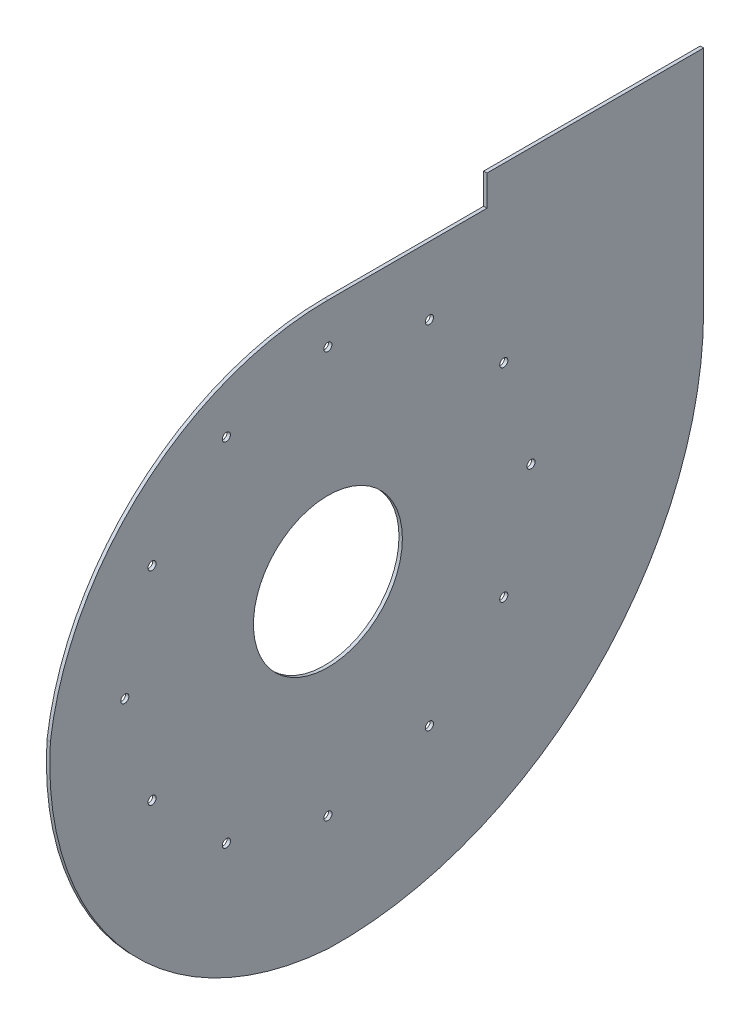
ISO-10303-21;
HEADER;
FILE_DESCRIPTION(('STEP AP214'),'2;1');
FILE_NAME('part.step','',(''),(''),'','','');
FILE_SCHEMA(('AUTOMOTIVE_DESIGN { 1 0 10303 214 1 1 1 1 }'));
ENDSEC;
DATA;
#1=APPLICATION_CONTEXT('core data for automotive mechanical design processes');
#2=APPLICATION_PROTOCOL_DEFINITION('international standard','automotive_design',2000,#1);
#3=PRODUCT_CONTEXT('',#1,'mechanical');
#4=PRODUCT('Part','Part','',(#3));
#5=PRODUCT_RELATED_PRODUCT_CATEGORY('part','',(#4));
#6=PRODUCT_DEFINITION_FORMATION('','',#4);
#7=PRODUCT_DEFINITION_CONTEXT('part definition',#1,'design');
#8=PRODUCT_DEFINITION('design','',#6,#7);
#9=PRODUCT_DEFINITION_SHAPE('','',#8);
#10=(LENGTH_UNIT() NAMED_UNIT(*) SI_UNIT(.MILLI.,.METRE.));
#11=(NAMED_UNIT(*) PLANE_ANGLE_UNIT() SI_UNIT($,.RADIAN.));
#12=(NAMED_UNIT(*) SI_UNIT($,.STERADIAN.) SOLID_ANGLE_UNIT());
#13=UNCERTAINTY_MEASURE_WITH_UNIT(LENGTH_MEASURE(1.E-05),#10,'distance_accuracy_value','');
#14=(GEOMETRIC_REPRESENTATION_CONTEXT(3) GLOBAL_UNCERTAINTY_ASSIGNED_CONTEXT((#13)) GLOBAL_UNIT_ASSIGNED_CONTEXT((#10,
#11,#12)) REPRESENTATION_CONTEXT('',''));
#15=CARTESIAN_POINT('',(0.,0.,0.));
#16=DIRECTION('',(0.,0.,1.));
#17=DIRECTION('',(1.,0.,0.));
#18=AXIS2_PLACEMENT_3D('',#15,#16,#17);
#19=CARTESIAN_POINT('',(5.,-290.185837618395,361.560614636202));
#20=DIRECTION('',(1.,0.,0.));
#21=DIRECTION('',(0.,0.,-1.));
#22=AXIS2_PLACEMENT_3D('',#19,#20,#21);
#23=PLANE('',#22);
#24=CARTESIAN_POINT('',(5.,-496.037113391724,511.985698368692));
#25=DIRECTION('',(1.,0.,0.));
#26=DIRECTION('',(0.,0.,-1.));
#27=AXIS2_PLACEMENT_3D('',#24,#25,#26);
#28=CIRCLE('',#27,5.99999999999999);
#29=CARTESIAN_POINT('',(5.,-496.037113391724,505.985698368692));
#30=VERTEX_POINT('',#29);
#31=EDGE_CURVE('E183',#30,#30,#28,.T.);
#32=ORIENTED_EDGE('',*,*,#31,.F.);
#33=EDGE_LOOP('',(#32));
#34=FACE_BOUND('',#33,.T.);
#35=CARTESIAN_POINT('',(5.,-536.229492256392,361.985698368692));
#36=DIRECTION('',(1.,0.,0.));
#37=DIRECTION('',(0.,0.,-1.));
#38=AXIS2_PLACEMENT_3D('',#35,#36,#37);
#39=CIRCLE('',#38,5.99999999999999);
#40=CARTESIAN_POINT('',(5.,-536.229492256392,355.985698368692));
#41=VERTEX_POINT('',#40);
#42=EDGE_CURVE('E186',#41,#41,#39,.T.);
#43=ORIENTED_EDGE('',*,*,#42,.F.);
#44=EDGE_LOOP('',(#43));
#45=FACE_BOUND('',#44,.T.);
#46=CARTESIAN_POINT('',(5.,-496.037113391723,211.985698368691));
#47=DIRECTION('',(1.,0.,0.));
#48=DIRECTION('',(0.,0.,-1.));
#49=AXIS2_PLACEMENT_3D('',#46,#47,#48);
#50=CIRCLE('',#49,5.99999999999999);
#51=CARTESIAN_POINT('',(5.,-496.037113391723,205.985698368691));
#52=VERTEX_POINT('',#51);
#53=EDGE_CURVE('E189',#52,#52,#50,.T.);
#54=ORIENTED_EDGE('',*,*,#53,.F.);
#55=EDGE_LOOP('',(#54));
#56=FACE_BOUND('',#55,.T.);
#57=CARTESIAN_POINT('',(5.,-386.229492256391,102.17807723336));
#58=DIRECTION('',(1.,0.,0.));
#59=DIRECTION('',(0.,0.,-1.));
#60=AXIS2_PLACEMENT_3D('',#57,#58,#59);
#61=CIRCLE('',#60,5.99999999999999);
#62=CARTESIAN_POINT('',(5.,-386.229492256391,96.1780772333602));
#63=VERTEX_POINT('',#62);
#64=EDGE_CURVE('E192',#63,#63,#61,.T.);
#65=ORIENTED_EDGE('',*,*,#64,.F.);
#66=EDGE_LOOP('',(#65));
#67=FACE_BOUND('',#66,.T.);
#68=CARTESIAN_POINT('',(5.,-236.229492256392,61.9856983686926));
#69=DIRECTION('',(1.,0.,0.));
#70=DIRECTION('',(0.,0.,-1.));
#71=AXIS2_PLACEMENT_3D('',#68,#69,#70);
#72=CIRCLE('',#71,5.99999999999999);
#73=CARTESIAN_POINT('',(5.,-236.229492256392,55.9856983686926));
#74=VERTEX_POINT('',#73);
#75=EDGE_CURVE('E195',#74,#74,#72,.T.);
#76=ORIENTED_EDGE('',*,*,#75,.F.);
#77=EDGE_LOOP('',(#76));
#78=FACE_BOUND('',#77,.T.);
#79=CARTESIAN_POINT('',(5.,-86.22949225639,102.178077233362));
#80=DIRECTION('',(1.,0.,0.));
#81=DIRECTION('',(0.,0.,-1.));
#82=AXIS2_PLACEMENT_3D('',#79,#80,#81);
#83=CIRCLE('',#82,5.99999999999999);
#84=CARTESIAN_POINT('',(5.,-86.22949225639,96.1780772333623));
#85=VERTEX_POINT('',#84);
#86=EDGE_CURVE('E198',#85,#85,#83,.T.);
#87=ORIENTED_EDGE('',*,*,#86,.F.);
#88=EDGE_LOOP('',(#87));
#89=FACE_BOUND('',#88,.T.);
#90=CARTESIAN_POINT('',(5.,23.578128878941,211.985698368695));
#91=DIRECTION('',(1.,0.,0.));
#92=DIRECTION('',(0.,0.,-1.));
#93=AXIS2_PLACEMENT_3D('',#90,#91,#92);
#94=CIRCLE('',#93,5.99999999999999);
#95=CARTESIAN_POINT('',(5.,23.578128878941,205.985698368695));
#96=VERTEX_POINT('',#95);
#97=EDGE_CURVE('E201',#96,#96,#94,.T.);
#98=ORIENTED_EDGE('',*,*,#97,.F.);
#99=EDGE_LOOP('',(#98));
#100=FACE_BOUND('',#99,.T.);
#101=CARTESIAN_POINT('',(5.,63.7705077436079,361.985698368696));
#102=DIRECTION('',(1.,0.,0.));
#103=DIRECTION('',(0.,0.,-1.));
#104=AXIS2_PLACEMENT_3D('',#101,#102,#103);
#105=CIRCLE('',#104,5.99999999999999);
#106=CARTESIAN_POINT('',(5.,63.7705077436079,355.985698368696));
#107=VERTEX_POINT('',#106);
#108=EDGE_CURVE('E204',#107,#107,#105,.T.);
#109=ORIENTED_EDGE('',*,*,#108,.F.);
#110=EDGE_LOOP('',(#109));
#111=FACE_BOUND('',#110,.T.);
#112=CARTESIAN_POINT('',(5.,23.5781288789377,511.985698368696));
#113=DIRECTION('',(1.,0.,0.));
#114=DIRECTION('',(0.,0.,-1.));
#115=AXIS2_PLACEMENT_3D('',#112,#113,#114);
#116=CIRCLE('',#115,5.99999999999999);
#117=CARTESIAN_POINT('',(5.,23.5781288789377,505.985698368696));
#118=VERTEX_POINT('',#117);
#119=EDGE_CURVE('E207',#118,#118,#116,.T.);
#120=ORIENTED_EDGE('',*,*,#119,.F.);
#121=EDGE_LOOP('',(#120));
#122=FACE_BOUND('',#121,.T.);
#123=CARTESIAN_POINT('',(5.,-86.2294922563954,621.793319504026));
#124=DIRECTION('',(1.,0.,0.));
#125=DIRECTION('',(0.,0.,-1.));
#126=AXIS2_PLACEMENT_3D('',#123,#124,#125);
#127=CIRCLE('',#126,5.99999999999999);
#128=CARTESIAN_POINT('',(5.,-86.2294922563954,615.793319504026));
#129=VERTEX_POINT('',#128);
#130=EDGE_CURVE('E210',#129,#129,#127,.T.);
#131=ORIENTED_EDGE('',*,*,#130,.F.);
#132=EDGE_LOOP('',(#131));
#133=FACE_BOUND('',#132,.T.);
#134=CARTESIAN_POINT('',(5.,-386.229492256392,621.793319504024));
#135=DIRECTION('',(1.,0.,0.));
#136=DIRECTION('',(0.,0.,-1.));
#137=AXIS2_PLACEMENT_3D('',#134,#135,#136);
#138=CIRCLE('',#137,5.99999999999999);
#139=CARTESIAN_POINT('',(5.,-386.229492256392,615.793319504024));
#140=VERTEX_POINT('',#139);
#141=EDGE_CURVE('E213',#140,#140,#138,.T.);
#142=ORIENTED_EDGE('',*,*,#141,.F.);
#143=EDGE_LOOP('',(#142));
#144=FACE_BOUND('',#143,.T.);
#145=CARTESIAN_POINT('',(5.,-236.229492256392,661.985698368693));
#146=DIRECTION('',(1.,0.,0.));
#147=DIRECTION('',(0.,0.,-1.));
#148=AXIS2_PLACEMENT_3D('',#145,#146,#147);
#149=CIRCLE('',#148,5.99999999999999);
#150=CARTESIAN_POINT('',(5.,-236.229492256392,655.985698368693));
#151=VERTEX_POINT('',#150);
#152=EDGE_CURVE('E175',#151,#151,#149,.T.);
#153=ORIENTED_EDGE('',*,*,#152,.F.);
#154=EDGE_LOOP('',(#153));
#155=FACE_BOUND('',#154,.T.);
#156=DIRECTION('',(0.,-1.,0.));
#157=VECTOR('',#156,1.);
#158=CARTESIAN_POINT('',(5.,168.770507743608,126.985698368693));
#159=LINE('',#158,#157);
#160=CARTESIAN_POINT('',(5.,168.770507743608,126.985698368693));
#161=VERTEX_POINT('',#160);
#162=CARTESIAN_POINT('',(5.,123.770507743608,126.985698368693));
#163=VERTEX_POINT('',#162);
#164=EDGE_CURVE('E148',#161,#163,#159,.T.);
#165=ORIENTED_EDGE('',*,*,#164,.T.);
#166=DIRECTION('',(0.,0.,1.));
#167=VECTOR('',#166,1.);
#168=CARTESIAN_POINT('',(5.,123.770507743608,126.985698368693));
#169=LINE('',#168,#167);
#170=CARTESIAN_POINT('',(5.,123.770507743608,361.985698368693));
#171=VERTEX_POINT('',#170);
#172=EDGE_CURVE('E101',#163,#171,#169,.T.);
#173=ORIENTED_EDGE('',*,*,#172,.T.);
#174=CARTESIAN_POINT('',(5.,-290.185837618395,361.560614636202));
#175=DIRECTION('',(1.,0.,0.));
#176=DIRECTION('',(0.,0.,-1.));
#177=AXIS2_PLACEMENT_3D('',#174,#175,#176);
#178=CIRCLE('',#177,413.956563617061);
#179=CARTESIAN_POINT('',(5.,-236.229492256392,771.985698368693));
#180=VERTEX_POINT('',#179);
#181=EDGE_CURVE('E160',#171,#180,#178,.T.);
#182=ORIENTED_EDGE('',*,*,#181,.T.);
#183=CARTESIAN_POINT('',(5.,-264.276775398884,329.747218068622));
#184=DIRECTION('',(1.,0.,0.));
#185=DIRECTION('',(0.,0.,-1.));
#186=AXIS2_PLACEMENT_3D('',#183,#184,#185);
#187=CIRCLE('',#186,443.126983549626);
#188=CARTESIAN_POINT('',(5.,-706.229492256392,361.985698368693));
#189=VERTEX_POINT('',#188);
#190=EDGE_CURVE('E117',#180,#189,#187,.T.);
#191=ORIENTED_EDGE('',*,*,#190,.T.);
#192=CARTESIAN_POINT('',(5.,-166.625210225188,346.803519257351));
#193=DIRECTION('',(1.,0.,0.));
#194=DIRECTION('',(0.,0.,1.));
#195=AXIS2_PLACEMENT_3D('',#192,#193,#194);
#196=CIRCLE('',#195,539.817820888658);
#197=CARTESIAN_POINT('',(5.,-166.625210225188,-193.014301631307));
#198=VERTEX_POINT('',#197);
#199=EDGE_CURVE('E111',#189,#198,#196,.T.);
#200=ORIENTED_EDGE('',*,*,#199,.T.);
#201=DIRECTION('',(0.,1.,0.));
#202=VECTOR('',#201,1.);
#203=CARTESIAN_POINT('',(5.,168.770507743608,-193.014301631307));
#204=LINE('',#203,#202);
#205=CARTESIAN_POINT('',(5.,168.770507743608,-193.014301631307));
#206=VERTEX_POINT('',#205);
#207=EDGE_CURVE('E115',#198,#206,#204,.T.);
#208=ORIENTED_EDGE('',*,*,#207,.T.);
#209=DIRECTION('',(0.,0.,1.));
#210=VECTOR('',#209,1.);
#211=CARTESIAN_POINT('',(5.,168.770507743608,126.985698368693));
#212=LINE('',#211,#210);
#213=EDGE_CURVE('E61',#206,#161,#212,.T.);
#214=ORIENTED_EDGE('',*,*,#213,.T.);
#215=EDGE_LOOP('',(#165,#173,#182,#191,#200,#208,#214));
#216=FACE_BOUND('',#215,.T.);
#217=CARTESIAN_POINT('',(5.,-236.229492256392,361.985698368693));
#218=DIRECTION('',(1.,0.,0.));
#219=DIRECTION('',(0.,0.,-1.));
#220=AXIS2_PLACEMENT_3D('',#217,#218,#219);
#221=CIRCLE('',#220,110.);
#222=CARTESIAN_POINT('',(5.,-236.229492256392,251.985698368693));
#223=VERTEX_POINT('',#222);
#224=EDGE_CURVE('E139',#223,#223,#221,.T.);
#225=ORIENTED_EDGE('',*,*,#224,.F.);
#226=EDGE_LOOP('',(#225));
#227=FACE_BOUND('',#226,.T.);
#228=ADVANCED_FACE('F44',(#34,#45,#56,#67,#78,#89,#100,#111,#122,#133,#144,#155,#216,#227),#23,.T.);
#229=CARTESIAN_POINT('',(0.,-290.185837618395,361.560614636202));
#230=DIRECTION('',(1.,0.,0.));
#231=DIRECTION('',(0.,0.,-1.));
#232=AXIS2_PLACEMENT_3D('',#229,#230,#231);
#233=PLANE('',#232);
#234=CARTESIAN_POINT('',(0.,-496.037113391724,511.985698368692));
#235=DIRECTION('',(-1.,0.,0.));
#236=DIRECTION('',(0.,-0.86602540378444,0.499999999999998));
#237=AXIS2_PLACEMENT_3D('',#234,#235,#236);
#238=CIRCLE('',#237,5.99999999999999);
#239=CARTESIAN_POINT('',(0.,-501.233265814431,514.985698368692));
#240=VERTEX_POINT('',#239);
#241=EDGE_CURVE('E219',#240,#240,#238,.T.);
#242=ORIENTED_EDGE('',*,*,#241,.F.);
#243=EDGE_LOOP('',(#242));
#244=FACE_BOUND('',#243,.T.);
#245=CARTESIAN_POINT('',(0.,-536.229492256392,361.985698368692));
#246=DIRECTION('',(-1.,0.,0.));
#247=DIRECTION('',(0.,-1.,0.));
#248=AXIS2_PLACEMENT_3D('',#245,#246,#247);
#249=CIRCLE('',#248,5.99999999999999);
#250=CARTESIAN_POINT('',(0.,-542.229492256392,361.985698368692));
#251=VERTEX_POINT('',#250);
#252=EDGE_CURVE('E239',#251,#251,#249,.T.);
#253=ORIENTED_EDGE('',*,*,#252,.F.);
#254=EDGE_LOOP('',(#253));
#255=FACE_BOUND('',#254,.T.);
#256=CARTESIAN_POINT('',(0.,-496.037113391723,211.985698368691));
#257=DIRECTION('',(-1.,0.,0.));
#258=DIRECTION('',(0.,-0.866025403784436,-0.500000000000004));
#259=AXIS2_PLACEMENT_3D('',#256,#257,#258);
#260=CIRCLE('',#259,5.99999999999999);
#261=CARTESIAN_POINT('',(0.,-501.23326581443,208.985698368691));
#262=VERTEX_POINT('',#261);
#263=EDGE_CURVE('E236',#262,#262,#260,.T.);
#264=ORIENTED_EDGE('',*,*,#263,.F.);
#265=EDGE_LOOP('',(#264));
#266=FACE_BOUND('',#265,.T.);
#267=CARTESIAN_POINT('',(0.,-386.229492256391,102.17807723336));
#268=DIRECTION('',(-1.,0.,0.));
#269=DIRECTION('',(0.,-0.499999999999995,-0.866025403784442));
#270=AXIS2_PLACEMENT_3D('',#267,#268,#269);
#271=CIRCLE('',#270,5.99999999999999);
#272=CARTESIAN_POINT('',(0.,-389.229492256391,96.9819248106535));
#273=VERTEX_POINT('',#272);
#274=EDGE_CURVE('E233',#273,#273,#271,.T.);
#275=ORIENTED_EDGE('',*,*,#274,.F.);
#276=EDGE_LOOP('',(#275));
#277=FACE_BOUND('',#276,.T.);
#278=CARTESIAN_POINT('',(0.,-236.229492256392,61.9856983686926));
#279=DIRECTION('',(-1.,0.,0.));
#280=DIRECTION('',(0.,0.,-1.));
#281=AXIS2_PLACEMENT_3D('',#278,#279,#280);
#282=CIRCLE('',#281,5.99999999999999);
#283=CARTESIAN_POINT('',(0.,-236.229492256392,55.9856983686926));
#284=VERTEX_POINT('',#283);
#285=EDGE_CURVE('E230',#284,#284,#282,.T.);
#286=ORIENTED_EDGE('',*,*,#285,.F.);
#287=EDGE_LOOP('',(#286));
#288=FACE_BOUND('',#287,.T.);
#289=CARTESIAN_POINT('',(0.,-86.22949225639,102.178077233362));
#290=DIRECTION('',(-1.,0.,0.));
#291=DIRECTION('',(0.,0.500000000000007,-0.866025403784435));
#292=AXIS2_PLACEMENT_3D('',#289,#290,#291);
#293=CIRCLE('',#292,5.99999999999999);
#294=CARTESIAN_POINT('',(0.,-83.2294922563899,96.9819248106557));
#295=VERTEX_POINT('',#294);
#296=EDGE_CURVE('E227',#295,#295,#293,.T.);
#297=ORIENTED_EDGE('',*,*,#296,.F.);
#298=EDGE_LOOP('',(#297));
#299=FACE_BOUND('',#298,.T.);
#300=CARTESIAN_POINT('',(0.,23.578128878941,211.985698368695));
#301=DIRECTION('',(-1.,0.,0.));
#302=DIRECTION('',(0.,0.866025403784443,-0.499999999999992));
#303=AXIS2_PLACEMENT_3D('',#300,#301,#302);
#304=CIRCLE('',#303,5.99999999999999);
#305=CARTESIAN_POINT('',(0.,28.7742813016476,208.985698368695));
#306=VERTEX_POINT('',#305);
#307=EDGE_CURVE('E223',#306,#306,#304,.T.);
#308=ORIENTED_EDGE('',*,*,#307,.F.);
#309=EDGE_LOOP('',(#308));
#310=FACE_BOUND('',#309,.T.);
#311=CARTESIAN_POINT('',(0.,63.7705077436079,361.985698368696));
#312=DIRECTION('',(-1.,0.,0.));
#313=DIRECTION('',(0.,1.,0.));
#314=AXIS2_PLACEMENT_3D('',#311,#312,#313);
#315=CIRCLE('',#314,5.99999999999999);
#316=CARTESIAN_POINT('',(0.,69.7705077436079,361.985698368696));
#317=VERTEX_POINT('',#316);
#318=EDGE_CURVE('E220',#317,#317,#315,.T.);
#319=ORIENTED_EDGE('',*,*,#318,.F.);
#320=EDGE_LOOP('',(#319));
#321=FACE_BOUND('',#320,.T.);
#322=CARTESIAN_POINT('',(0.,23.5781288789377,511.985698368696));
#323=DIRECTION('',(-1.,0.,0.));
#324=DIRECTION('',(0.,0.866025403784433,0.50000000000001));
#325=AXIS2_PLACEMENT_3D('',#322,#323,#324);
#326=CIRCLE('',#325,5.99999999999999);
#327=CARTESIAN_POINT('',(0.,28.7742813016443,514.985698368696));
#328=VERTEX_POINT('',#327);
#329=EDGE_CURVE('E224',#328,#328,#326,.T.);
#330=ORIENTED_EDGE('',*,*,#329,.F.);
#331=EDGE_LOOP('',(#330));
#332=FACE_BOUND('',#331,.T.);
#333=CARTESIAN_POINT('',(0.,-86.2294922563954,621.793319504026));
#334=DIRECTION('',(-1.,0.,0.));
#335=DIRECTION('',(0.,0.499999999999989,0.866025403784445));
#336=AXIS2_PLACEMENT_3D('',#333,#334,#335);
#337=CIRCLE('',#336,5.99999999999999);
#338=CARTESIAN_POINT('',(0.,-83.2294922563955,626.989471926733));
#339=VERTEX_POINT('',#338);
#340=EDGE_CURVE('E244',#339,#339,#337,.T.);
#341=ORIENTED_EDGE('',*,*,#340,.F.);
#342=EDGE_LOOP('',(#341));
#343=FACE_BOUND('',#342,.T.);
#344=CARTESIAN_POINT('',(0.,-386.229492256392,621.793319504024));
#345=DIRECTION('',(-1.,0.,0.));
#346=DIRECTION('',(0.,-0.500000000000001,0.866025403784438));
#347=AXIS2_PLACEMENT_3D('',#344,#345,#346);
#348=CIRCLE('',#347,5.99999999999999);
#349=CARTESIAN_POINT('',(0.,-389.229492256392,626.989471926731));
#350=VERTEX_POINT('',#349);
#351=EDGE_CURVE('E216',#350,#350,#348,.T.);
#352=ORIENTED_EDGE('',*,*,#351,.F.);
#353=EDGE_LOOP('',(#352));
#354=FACE_BOUND('',#353,.T.);
#355=CARTESIAN_POINT('',(0.,-236.229492256392,661.985698368693));
#356=DIRECTION('',(-1.,0.,0.));
#357=DIRECTION('',(0.,0.,1.));
#358=AXIS2_PLACEMENT_3D('',#355,#356,#357);
#359=CIRCLE('',#358,5.99999999999999);
#360=CARTESIAN_POINT('',(0.,-236.229492256392,667.985698368693));
#361=VERTEX_POINT('',#360);
#362=EDGE_CURVE('E180',#361,#361,#359,.T.);
#363=ORIENTED_EDGE('',*,*,#362,.F.);
#364=EDGE_LOOP('',(#363));
#365=FACE_BOUND('',#364,.T.);
#366=DIRECTION('',(0.,-1.,0.));
#367=VECTOR('',#366,1.);
#368=CARTESIAN_POINT('',(0.,168.770507743608,126.985698368693));
#369=LINE('',#368,#367);
#370=CARTESIAN_POINT('',(0.,168.770507743608,126.985698368693));
#371=VERTEX_POINT('',#370);
#372=CARTESIAN_POINT('',(0.,123.770507743608,126.985698368693));
#373=VERTEX_POINT('',#372);
#374=EDGE_CURVE('E135',#371,#373,#369,.T.);
#375=ORIENTED_EDGE('',*,*,#374,.F.);
#376=DIRECTION('',(0.,0.,1.));
#377=VECTOR('',#376,1.);
#378=CARTESIAN_POINT('',(0.,168.770507743608,126.985698368693));
#379=LINE('',#378,#377);
#380=CARTESIAN_POINT('',(0.,168.770507743608,-193.014301631307));
#381=VERTEX_POINT('',#380);
#382=EDGE_CURVE('E93',#381,#371,#379,.T.);
#383=ORIENTED_EDGE('',*,*,#382,.F.);
#384=DIRECTION('',(0.,1.,0.));
#385=VECTOR('',#384,1.);
#386=CARTESIAN_POINT('',(0.,168.770507743608,-193.014301631307));
#387=LINE('',#386,#385);
#388=CARTESIAN_POINT('',(0.,-166.625210225188,-193.014301631307));
#389=VERTEX_POINT('',#388);
#390=EDGE_CURVE('E87',#389,#381,#387,.T.);
#391=ORIENTED_EDGE('',*,*,#390,.F.);
#392=CARTESIAN_POINT('',(0.,-166.625210225188,346.803519257351));
#393=DIRECTION('',(1.,0.,0.));
#394=DIRECTION('',(0.,0.,1.));
#395=AXIS2_PLACEMENT_3D('',#392,#393,#394);
#396=CIRCLE('',#395,539.817820888658);
#397=CARTESIAN_POINT('',(0.,-706.229492256392,361.985698368693));
#398=VERTEX_POINT('',#397);
#399=EDGE_CURVE('E125',#398,#389,#396,.T.);
#400=ORIENTED_EDGE('',*,*,#399,.F.);
#401=CARTESIAN_POINT('',(0.,-264.276775398884,329.747218068622));
#402=DIRECTION('',(1.,0.,0.));
#403=DIRECTION('',(0.,0.,-1.));
#404=AXIS2_PLACEMENT_3D('',#401,#402,#403);
#405=CIRCLE('',#404,443.126983549626);
#406=CARTESIAN_POINT('',(0.,-236.229492256392,771.985698368693));
#407=VERTEX_POINT('',#406);
#408=EDGE_CURVE('E143',#407,#398,#405,.T.);
#409=ORIENTED_EDGE('',*,*,#408,.F.);
#410=CARTESIAN_POINT('',(0.,-290.185837618395,361.560614636202));
#411=DIRECTION('',(1.,0.,0.));
#412=DIRECTION('',(0.,0.,-1.));
#413=AXIS2_PLACEMENT_3D('',#410,#411,#412);
#414=CIRCLE('',#413,413.956563617061);
#415=CARTESIAN_POINT('',(0.,123.770507743608,361.985698368693));
#416=VERTEX_POINT('',#415);
#417=EDGE_CURVE('E141',#416,#407,#414,.T.);
#418=ORIENTED_EDGE('',*,*,#417,.F.);
#419=DIRECTION('',(0.,0.,1.));
#420=VECTOR('',#419,1.);
#421=CARTESIAN_POINT('',(0.,123.770507743608,126.985698368693));
#422=LINE('',#421,#420);
#423=EDGE_CURVE('E138',#373,#416,#422,.T.);
#424=ORIENTED_EDGE('',*,*,#423,.F.);
#425=EDGE_LOOP('',(#375,#383,#391,#400,#409,#418,#424));
#426=FACE_BOUND('',#425,.T.);
#427=CARTESIAN_POINT('',(0.,-236.229492256392,361.985698368693));
#428=DIRECTION('',(1.,0.,0.));
#429=DIRECTION('',(0.,0.,-1.));
#430=AXIS2_PLACEMENT_3D('',#427,#428,#429);
#431=CIRCLE('',#430,110.);
#432=CARTESIAN_POINT('',(0.,-236.229492256392,251.985698368693));
#433=VERTEX_POINT('',#432);
#434=EDGE_CURVE('E172',#433,#433,#431,.T.);
#435=ORIENTED_EDGE('',*,*,#434,.T.);
#436=EDGE_LOOP('',(#435));
#437=FACE_BOUND('',#436,.T.);
#438=ADVANCED_FACE('F164',(#244,#255,#266,#277,#288,#299,#310,#321,#332,#343,#354,#365,#426,
#437),#233,.F.);
#439=CARTESIAN_POINT('',(5.,168.770507743608,126.985698368693));
#440=DIRECTION('',(0.,0.,-1.));
#441=DIRECTION('',(-1.,0.,0.));
#442=AXIS2_PLACEMENT_3D('',#439,#440,#441);
#443=PLANE('',#442);
#444=ORIENTED_EDGE('',*,*,#374,.T.);
#445=DIRECTION('',(-1.,0.,0.));
#446=VECTOR('',#445,1.);
#447=CARTESIAN_POINT('',(5.,123.770507743608,126.985698368693));
#448=LINE('',#447,#446);
#449=EDGE_CURVE('E13',#163,#373,#448,.T.);
#450=ORIENTED_EDGE('',*,*,#449,.F.);
#451=ORIENTED_EDGE('',*,*,#164,.F.);
#452=DIRECTION('',(-1.,0.,0.));
#453=VECTOR('',#452,1.);
#454=CARTESIAN_POINT('',(5.,168.770507743608,126.985698368693));
#455=LINE('',#454,#453);
#456=EDGE_CURVE('E131',#161,#371,#455,.T.);
#457=ORIENTED_EDGE('',*,*,#456,.T.);
#458=EDGE_LOOP('',(#444,#450,#451,#457));
#459=FACE_BOUND('',#458,.T.);
#460=ADVANCED_FACE('F46',(#459),#443,.F.);
#461=CARTESIAN_POINT('',(5.,123.770507743608,126.985698368693));
#462=DIRECTION('',(0.,-1.,0.));
#463=DIRECTION('',(0.,0.,-1.));
#464=AXIS2_PLACEMENT_3D('',#461,#462,#463);
#465=PLANE('',#464);
#466=ORIENTED_EDGE('',*,*,#423,.T.);
#467=DIRECTION('',(-1.,0.,0.));
#468=VECTOR('',#467,1.);
#469=CARTESIAN_POINT('',(5.,123.770507743608,361.985698368693));
#470=LINE('',#469,#468);
#471=EDGE_CURVE('E53',#171,#416,#470,.T.);
#472=ORIENTED_EDGE('',*,*,#471,.F.);
#473=ORIENTED_EDGE('',*,*,#172,.F.);
#474=ORIENTED_EDGE('',*,*,#449,.T.);
#475=EDGE_LOOP('',(#466,#472,#473,#474));
#476=FACE_BOUND('',#475,.T.);
#477=ADVANCED_FACE('F295',(#476),#465,.F.);
#478=CARTESIAN_POINT('',(5.,-290.185837618395,361.560614636202));
#479=DIRECTION('',(-1.,0.,0.));
#480=DIRECTION('',(0.,0.,1.));
#481=AXIS2_PLACEMENT_3D('',#478,#479,#480);
#482=CYLINDRICAL_SURFACE('',#481,413.956563617061);
#483=ORIENTED_EDGE('',*,*,#417,.T.);
#484=DIRECTION('',(-1.,0.,0.));
#485=VECTOR('',#484,1.);
#486=CARTESIAN_POINT('',(5.,-236.229492256392,771.985698368693));
#487=LINE('',#486,#485);
#488=EDGE_CURVE('E152',#180,#407,#487,.T.);
#489=ORIENTED_EDGE('',*,*,#488,.F.);
#490=ORIENTED_EDGE('',*,*,#181,.F.);
#491=ORIENTED_EDGE('',*,*,#471,.T.);
#492=EDGE_LOOP('',(#483,#489,#490,#491));
#493=FACE_BOUND('',#492,.T.);
#494=ADVANCED_FACE('F158',(#493),#482,.T.);
#495=CARTESIAN_POINT('',(5.,-264.276775398884,329.747218068622));
#496=DIRECTION('',(-1.,0.,0.));
#497=DIRECTION('',(0.,0.,1.));
#498=AXIS2_PLACEMENT_3D('',#495,#496,#497);
#499=CYLINDRICAL_SURFACE('',#498,443.126983549626);
#500=ORIENTED_EDGE('',*,*,#408,.T.);
#501=DIRECTION('',(-1.,0.,0.));
#502=VECTOR('',#501,1.);
#503=CARTESIAN_POINT('',(5.,-706.229492256392,361.985698368693));
#504=LINE('',#503,#502);
#505=EDGE_CURVE('E126',#189,#398,#504,.T.);
#506=ORIENTED_EDGE('',*,*,#505,.F.);
#507=ORIENTED_EDGE('',*,*,#190,.F.);
#508=ORIENTED_EDGE('',*,*,#488,.T.);
#509=EDGE_LOOP('',(#500,#506,#507,#508));
#510=FACE_BOUND('',#509,.T.);
#511=ADVANCED_FACE('F167',(#510),#499,.T.);
#512=CARTESIAN_POINT('',(5.,-166.625210225188,346.803519257351));
#513=DIRECTION('',(-1.,0.,0.));
#514=DIRECTION('',(0.,0.,1.));
#515=AXIS2_PLACEMENT_3D('',#512,#513,#514);
#516=CYLINDRICAL_SURFACE('',#515,539.817820888658);
#517=ORIENTED_EDGE('',*,*,#399,.T.);
#518=DIRECTION('',(-1.,0.,0.));
#519=VECTOR('',#518,1.);
#520=CARTESIAN_POINT('',(5.,-166.625210225188,-193.014301631307));
#521=LINE('',#520,#519);
#522=EDGE_CURVE('E122',#198,#389,#521,.T.);
#523=ORIENTED_EDGE('',*,*,#522,.F.);
#524=ORIENTED_EDGE('',*,*,#199,.F.);
#525=ORIENTED_EDGE('',*,*,#505,.T.);
#526=EDGE_LOOP('',(#517,#523,#524,#525));
#527=FACE_BOUND('',#526,.T.);
#528=ADVANCED_FACE('F123',(#527),#516,.T.);
#529=CARTESIAN_POINT('',(5.,168.770507743608,-193.014301631307));
#530=DIRECTION('',(0.,0.,1.));
#531=DIRECTION('',(0.,-1.,0.));
#532=AXIS2_PLACEMENT_3D('',#529,#530,#531);
#533=PLANE('',#532);
#534=ORIENTED_EDGE('',*,*,#390,.T.);
#535=DIRECTION('',(-1.,0.,0.));
#536=VECTOR('',#535,1.);
#537=CARTESIAN_POINT('',(5.,168.770507743608,-193.014301631307));
#538=LINE('',#537,#536);
#539=EDGE_CURVE('E127',#206,#381,#538,.T.);
#540=ORIENTED_EDGE('',*,*,#539,.F.);
#541=ORIENTED_EDGE('',*,*,#207,.F.);
#542=ORIENTED_EDGE('',*,*,#522,.T.);
#543=EDGE_LOOP('',(#534,#540,#541,#542));
#544=FACE_BOUND('',#543,.T.);
#545=ADVANCED_FACE('F129',(#544),#533,.F.);
#546=CARTESIAN_POINT('',(5.,168.770507743608,126.985698368693));
#547=DIRECTION('',(0.,-1.,0.));
#548=DIRECTION('',(0.,0.,-1.));
#549=AXIS2_PLACEMENT_3D('',#546,#547,#548);
#550=PLANE('',#549);
#551=ORIENTED_EDGE('',*,*,#382,.T.);
#552=ORIENTED_EDGE('',*,*,#456,.F.);
#553=ORIENTED_EDGE('',*,*,#213,.F.);
#554=ORIENTED_EDGE('',*,*,#539,.T.);
#555=EDGE_LOOP('',(#551,#552,#553,#554));
#556=FACE_BOUND('',#555,.T.);
#557=ADVANCED_FACE('F275',(#556),#550,.F.);
#558=CARTESIAN_POINT('',(5.,-236.229492256392,361.985698368693));
#559=DIRECTION('',(-1.,0.,0.));
#560=DIRECTION('',(0.,0.,1.));
#561=AXIS2_PLACEMENT_3D('',#558,#559,#560);
#562=CYLINDRICAL_SURFACE('',#561,110.);
#563=ORIENTED_EDGE('',*,*,#224,.T.);
#564=EDGE_LOOP('',(#563));
#565=FACE_BOUND('',#564,.T.);
#566=ORIENTED_EDGE('',*,*,#434,.F.);
#567=EDGE_LOOP('',(#566));
#568=FACE_BOUND('',#567,.T.);
#569=ADVANCED_FACE('F265',(#565,#568),#562,.F.);
#570=CARTESIAN_POINT('',(10.,-236.229492256392,661.985698368693));
#571=DIRECTION('',(-1.,0.,0.));
#572=DIRECTION('',(0.,0.,1.));
#573=AXIS2_PLACEMENT_3D('',#570,#571,#572);
#574=CYLINDRICAL_SURFACE('',#573,5.99999999999999);
#575=ORIENTED_EDGE('',*,*,#152,.T.);
#576=EDGE_LOOP('',(#575));
#577=FACE_BOUND('',#576,.T.);
#578=ORIENTED_EDGE('',*,*,#362,.T.);
#579=EDGE_LOOP('',(#578));
#580=FACE_BOUND('',#579,.T.);
#581=ADVANCED_FACE('F262',(#577,#580),#574,.F.);
#582=CARTESIAN_POINT('',(10.,-386.229492256392,621.793319504024));
#583=DIRECTION('',(-1.,0.,0.));
#584=DIRECTION('',(0.,0.,1.));
#585=AXIS2_PLACEMENT_3D('',#582,#583,#584);
#586=CYLINDRICAL_SURFACE('',#585,5.99999999999999);
#587=ORIENTED_EDGE('',*,*,#141,.T.);
#588=EDGE_LOOP('',(#587));
#589=FACE_BOUND('',#588,.T.);
#590=ORIENTED_EDGE('',*,*,#351,.T.);
#591=EDGE_LOOP('',(#590));
#592=FACE_BOUND('',#591,.T.);
#593=ADVANCED_FACE('F264',(#589,#592),#586,.F.);
#594=CARTESIAN_POINT('',(10.,-86.2294922563954,621.793319504026));
#595=DIRECTION('',(-1.,0.,0.));
#596=DIRECTION('',(0.,0.,1.));
#597=AXIS2_PLACEMENT_3D('',#594,#595,#596);
#598=CYLINDRICAL_SURFACE('',#597,5.99999999999999);
#599=ORIENTED_EDGE('',*,*,#130,.T.);
#600=EDGE_LOOP('',(#599));
#601=FACE_BOUND('',#600,.T.);
#602=ORIENTED_EDGE('',*,*,#340,.T.);
#603=EDGE_LOOP('',(#602));
#604=FACE_BOUND('',#603,.T.);
#605=ADVANCED_FACE('F272',(#601,#604),#598,.F.);
#606=CARTESIAN_POINT('',(10.,23.5781288789377,511.985698368696));
#607=DIRECTION('',(-1.,0.,0.));
#608=DIRECTION('',(0.,0.,1.));
#609=AXIS2_PLACEMENT_3D('',#606,#607,#608);
#610=CYLINDRICAL_SURFACE('',#609,5.99999999999999);
#611=ORIENTED_EDGE('',*,*,#119,.T.);
#612=EDGE_LOOP('',(#611));
#613=FACE_BOUND('',#612,.T.);
#614=ORIENTED_EDGE('',*,*,#329,.T.);
#615=EDGE_LOOP('',(#614));
#616=FACE_BOUND('',#615,.T.);
#617=ADVANCED_FACE('F250',(#613,#616),#610,.F.);
#618=CARTESIAN_POINT('',(10.,63.7705077436079,361.985698368696));
#619=DIRECTION('',(-1.,0.,0.));
#620=DIRECTION('',(0.,0.,1.));
#621=AXIS2_PLACEMENT_3D('',#618,#619,#620);
#622=CYLINDRICAL_SURFACE('',#621,5.99999999999999);
#623=ORIENTED_EDGE('',*,*,#108,.T.);
#624=EDGE_LOOP('',(#623));
#625=FACE_BOUND('',#624,.T.);
#626=ORIENTED_EDGE('',*,*,#318,.T.);
#627=EDGE_LOOP('',(#626));
#628=FACE_BOUND('',#627,.T.);
#629=ADVANCED_FACE('F376',(#625,#628),#622,.F.);
#630=CARTESIAN_POINT('',(10.,23.578128878941,211.985698368695));
#631=DIRECTION('',(-1.,0.,0.));
#632=DIRECTION('',(0.,0.,1.));
#633=AXIS2_PLACEMENT_3D('',#630,#631,#632);
#634=CYLINDRICAL_SURFACE('',#633,5.99999999999999);
#635=ORIENTED_EDGE('',*,*,#97,.T.);
#636=EDGE_LOOP('',(#635));
#637=FACE_BOUND('',#636,.T.);
#638=ORIENTED_EDGE('',*,*,#307,.T.);
#639=EDGE_LOOP('',(#638));
#640=FACE_BOUND('',#639,.T.);
#641=ADVANCED_FACE('F385',(#637,#640),#634,.F.);
#642=CARTESIAN_POINT('',(10.,-86.22949225639,102.178077233362));
#643=DIRECTION('',(-1.,0.,0.));
#644=DIRECTION('',(0.,0.,1.));
#645=AXIS2_PLACEMENT_3D('',#642,#643,#644);
#646=CYLINDRICAL_SURFACE('',#645,5.99999999999999);
#647=ORIENTED_EDGE('',*,*,#86,.T.);
#648=EDGE_LOOP('',(#647));
#649=FACE_BOUND('',#648,.T.);
#650=ORIENTED_EDGE('',*,*,#296,.T.);
#651=EDGE_LOOP('',(#650));
#652=FACE_BOUND('',#651,.T.);
#653=ADVANCED_FACE('F394',(#649,#652),#646,.F.);
#654=CARTESIAN_POINT('',(10.,-236.229492256392,61.9856983686926));
#655=DIRECTION('',(-1.,0.,0.));
#656=DIRECTION('',(0.,0.,1.));
#657=AXIS2_PLACEMENT_3D('',#654,#655,#656);
#658=CYLINDRICAL_SURFACE('',#657,5.99999999999999);
#659=ORIENTED_EDGE('',*,*,#75,.T.);
#660=EDGE_LOOP('',(#659));
#661=FACE_BOUND('',#660,.T.);
#662=ORIENTED_EDGE('',*,*,#285,.T.);
#663=EDGE_LOOP('',(#662));
#664=FACE_BOUND('',#663,.T.);
#665=ADVANCED_FACE('F403',(#661,#664),#658,.F.);
#666=CARTESIAN_POINT('',(10.,-386.229492256391,102.17807723336));
#667=DIRECTION('',(-1.,0.,0.));
#668=DIRECTION('',(0.,0.,1.));
#669=AXIS2_PLACEMENT_3D('',#666,#667,#668);
#670=CYLINDRICAL_SURFACE('',#669,5.99999999999999);
#671=ORIENTED_EDGE('',*,*,#64,.T.);
#672=EDGE_LOOP('',(#671));
#673=FACE_BOUND('',#672,.T.);
#674=ORIENTED_EDGE('',*,*,#274,.T.);
#675=EDGE_LOOP('',(#674));
#676=FACE_BOUND('',#675,.T.);
#677=ADVANCED_FACE('F412',(#673,#676),#670,.F.);
#678=CARTESIAN_POINT('',(10.,-496.037113391723,211.985698368691));
#679=DIRECTION('',(-1.,0.,0.));
#680=DIRECTION('',(0.,0.,1.));
#681=AXIS2_PLACEMENT_3D('',#678,#679,#680);
#682=CYLINDRICAL_SURFACE('',#681,5.99999999999999);
#683=ORIENTED_EDGE('',*,*,#53,.T.);
#684=EDGE_LOOP('',(#683));
#685=FACE_BOUND('',#684,.T.);
#686=ORIENTED_EDGE('',*,*,#263,.T.);
#687=EDGE_LOOP('',(#686));
#688=FACE_BOUND('',#687,.T.);
#689=ADVANCED_FACE('F421',(#685,#688),#682,.F.);
#690=CARTESIAN_POINT('',(10.,-536.229492256392,361.985698368692));
#691=DIRECTION('',(-1.,0.,0.));
#692=DIRECTION('',(0.,0.,1.));
#693=AXIS2_PLACEMENT_3D('',#690,#691,#692);
#694=CYLINDRICAL_SURFACE('',#693,5.99999999999999);
#695=ORIENTED_EDGE('',*,*,#42,.T.);
#696=EDGE_LOOP('',(#695));
#697=FACE_BOUND('',#696,.T.);
#698=ORIENTED_EDGE('',*,*,#252,.T.);
#699=EDGE_LOOP('',(#698));
#700=FACE_BOUND('',#699,.T.);
#701=ADVANCED_FACE('F430',(#697,#700),#694,.F.);
#702=CARTESIAN_POINT('',(10.,-496.037113391724,511.985698368692));
#703=DIRECTION('',(-1.,0.,0.));
#704=DIRECTION('',(0.,0.,1.));
#705=AXIS2_PLACEMENT_3D('',#702,#703,#704);
#706=CYLINDRICAL_SURFACE('',#705,5.99999999999999);
#707=ORIENTED_EDGE('',*,*,#31,.T.);
#708=EDGE_LOOP('',(#707));
#709=FACE_BOUND('',#708,.T.);
#710=ORIENTED_EDGE('',*,*,#241,.T.);
#711=EDGE_LOOP('',(#710));
#712=FACE_BOUND('',#711,.T.);
#713=ADVANCED_FACE('F439',(#709,#712),#706,.F.);
#714=CLOSED_SHELL('',(#228,#438,#460,#477,#494,#511,#528,#545,#557,#569,#581,#593,#605,#617,
#629,#641,#653,#665,#677,#689,#701,#713));
#715=MANIFOLD_SOLID_BREP('B2',#714);
#716=ADVANCED_BREP_SHAPE_REPRESENTATION('',(#18,#715),#14);
#717=SHAPE_DEFINITION_REPRESENTATION(#9,#716);
ENDSEC;
END-ISO-10303-21;
